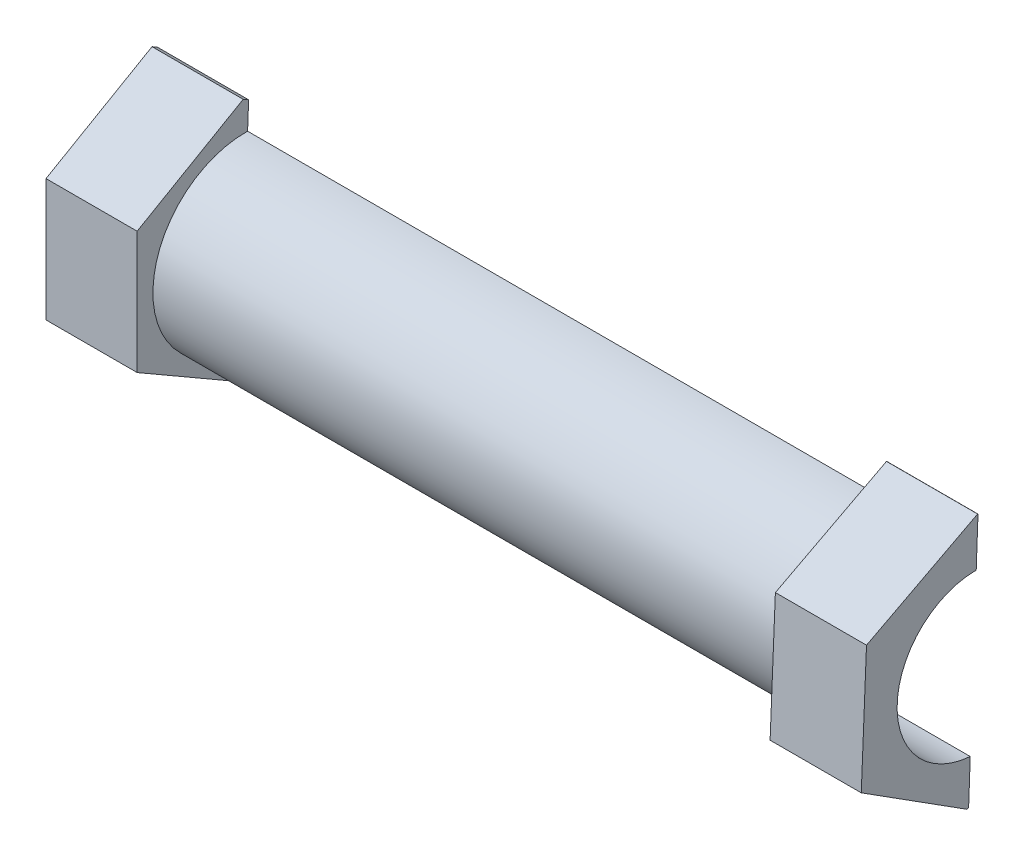
ISO-10303-21;
HEADER;
FILE_DESCRIPTION(('STEP AP214'),'2;1');
FILE_NAME('part.step','',(''),(''),'','','');
FILE_SCHEMA(('AUTOMOTIVE_DESIGN { 1 0 10303 214 1 1 1 1 }'));
ENDSEC;
DATA;
#1=APPLICATION_CONTEXT('core data for automotive mechanical design processes');
#2=APPLICATION_PROTOCOL_DEFINITION('international standard','automotive_design',2000,#1);
#3=PRODUCT_CONTEXT('',#1,'mechanical');
#4=PRODUCT('Part','Part','',(#3));
#5=PRODUCT_RELATED_PRODUCT_CATEGORY('part','',(#4));
#6=PRODUCT_DEFINITION_FORMATION('','',#4);
#7=PRODUCT_DEFINITION_CONTEXT('part definition',#1,'design');
#8=PRODUCT_DEFINITION('design','',#6,#7);
#9=PRODUCT_DEFINITION_SHAPE('','',#8);
#10=(LENGTH_UNIT() NAMED_UNIT(*) SI_UNIT(.MILLI.,.METRE.));
#11=(NAMED_UNIT(*) PLANE_ANGLE_UNIT() SI_UNIT($,.RADIAN.));
#12=(NAMED_UNIT(*) SI_UNIT($,.STERADIAN.) SOLID_ANGLE_UNIT());
#13=UNCERTAINTY_MEASURE_WITH_UNIT(LENGTH_MEASURE(1.E-05),#10,'distance_accuracy_value','');
#14=(GEOMETRIC_REPRESENTATION_CONTEXT(3) GLOBAL_UNCERTAINTY_ASSIGNED_CONTEXT((#13)) GLOBAL_UNIT_ASSIGNED_CONTEXT((#10,
#11,#12)) REPRESENTATION_CONTEXT('',''));
#15=CARTESIAN_POINT('',(0.,0.,0.));
#16=DIRECTION('',(0.,0.,1.));
#17=DIRECTION('',(1.,0.,0.));
#18=AXIS2_PLACEMENT_3D('',#15,#16,#17);
#19=CARTESIAN_POINT('',(350.,0.,-1.28970231793346));
#20=DIRECTION('',(-1.,0.,0.));
#21=DIRECTION('',(0.,0.,1.));
#22=AXIS2_PLACEMENT_3D('',#19,#20,#21);
#23=CYLINDRICAL_SURFACE('',#22,50.8003751134074);
#24=CARTESIAN_POINT('',(350.,0.,-1.28970231793346));
#25=DIRECTION('',(1.,0.,0.));
#26=DIRECTION('',(0.,0.,-1.));
#27=AXIS2_PLACEMENT_3D('',#24,#25,#26);
#28=CIRCLE('',#27,50.8003751134074);
#29=CARTESIAN_POINT('',(350.,50.7875610327071,-2.43064754534503));
#30=VERTEX_POINT('',#29);
#31=CARTESIAN_POINT('',(350.,-50.7298348775202,1.38648245940075));
#32=VERTEX_POINT('',#31);
#33=EDGE_CURVE('E224',#30,#32,#28,.T.);
#34=ORIENTED_EDGE('',*,*,#33,.F.);
#35=DIRECTION('',(-1.,0.,0.));
#36=VECTOR('',#35,1.);
#37=CARTESIAN_POINT('',(350.,50.7875610327071,-2.43064754534503));
#38=LINE('',#37,#36);
#39=CARTESIAN_POINT('',(0.,50.7875610327071,-2.43064754534503));
#40=VERTEX_POINT('',#39);
#41=EDGE_CURVE('E317',#30,#40,#38,.T.);
#42=ORIENTED_EDGE('',*,*,#41,.T.);
#43=CARTESIAN_POINT('',(0.,0.,-1.28970231793346));
#44=DIRECTION('',(1.,0.,0.));
#45=DIRECTION('',(0.,0.,-1.));
#46=AXIS2_PLACEMENT_3D('',#43,#44,#45);
#47=CIRCLE('',#46,50.8003751134074);
#48=CARTESIAN_POINT('',(0.,-50.7298348775202,1.38648245940076));
#49=VERTEX_POINT('',#48);
#50=EDGE_CURVE('E202',#40,#49,#47,.T.);
#51=ORIENTED_EDGE('',*,*,#50,.T.);
#52=DIRECTION('',(-1.,0.,0.));
#53=VECTOR('',#52,1.);
#54=CARTESIAN_POINT('',(350.,-50.7298348775202,1.38648245940075));
#55=LINE('',#54,#53);
#56=EDGE_CURVE('E309',#49,#32,#55,.F.);
#57=ORIENTED_EDGE('',*,*,#56,.T.);
#58=EDGE_LOOP('',(#34,#42,#51,#57));
#59=FACE_BOUND('',#58,.T.);
#60=ADVANCED_FACE('F33',(#59),#23,.T.);
#61=CARTESIAN_POINT('',(350.,0.,-1.28970231793346));
#62=DIRECTION('',(-1.,0.,0.));
#63=DIRECTION('',(0.,0.,1.));
#64=AXIS2_PLACEMENT_3D('',#61,#62,#63);
#65=CYLINDRICAL_SURFACE('',#64,47.812951640793);
#66=DIRECTION('',(-1.,0.,0.));
#67=VECTOR('',#66,1.);
#68=CARTESIAN_POINT('',(350.,47.8018844697725,-2.31838387377763));
#69=LINE('',#68,#67);
#70=CARTESIAN_POINT('',(350.,47.8018844697725,-2.31838387377763));
#71=VERTEX_POINT('',#70);
#72=CARTESIAN_POINT('',(0.,47.8018844697725,-2.31838387377763));
#73=VERTEX_POINT('',#72);
#74=EDGE_CURVE('E325',#71,#73,#69,.T.);
#75=ORIENTED_EDGE('',*,*,#74,.F.);
#76=CARTESIAN_POINT('',(350.,0.,-1.28970231793346));
#77=DIRECTION('',(1.,0.,0.));
#78=DIRECTION('',(0.,0.,-1.));
#79=AXIS2_PLACEMENT_3D('',#76,#77,#78);
#80=CIRCLE('',#79,47.812951640793);
#81=CARTESIAN_POINT('',(350.,-47.7441583145856,1.27421878783335));
#82=VERTEX_POINT('',#81);
#83=EDGE_CURVE('E218',#71,#82,#80,.T.);
#84=ORIENTED_EDGE('',*,*,#83,.T.);
#85=DIRECTION('',(-1.,0.,0.));
#86=VECTOR('',#85,1.);
#87=CARTESIAN_POINT('',(350.,-47.7441583145856,1.27421878783335));
#88=LINE('',#87,#86);
#89=CARTESIAN_POINT('',(0.,-47.7441583145856,1.27421878783335));
#90=VERTEX_POINT('',#89);
#91=EDGE_CURVE('E333',#90,#82,#88,.F.);
#92=ORIENTED_EDGE('',*,*,#91,.F.);
#93=CARTESIAN_POINT('',(0.,0.,-1.28970231793346));
#94=DIRECTION('',(1.,0.,0.));
#95=DIRECTION('',(0.,0.,-1.));
#96=AXIS2_PLACEMENT_3D('',#93,#94,#95);
#97=CIRCLE('',#96,47.812951640793);
#98=EDGE_CURVE('E221',#73,#90,#97,.T.);
#99=ORIENTED_EDGE('',*,*,#98,.F.);
#100=EDGE_LOOP('',(#75,#84,#92,#99));
#101=FACE_BOUND('',#100,.T.);
#102=ADVANCED_FACE('F365',(#101),#65,.F.);
#103=CARTESIAN_POINT('',(350.,0.,0.));
#104=DIRECTION('',(1.,0.,0.));
#105=DIRECTION('',(0.,0.,-1.));
#106=AXIS2_PLACEMENT_3D('',#103,#104,#105);
#107=PLANE('',#106);
#108=ORIENTED_EDGE('',*,*,#83,.F.);
#109=DIRECTION('',(0.,-0.999293840577614,0.0375741957151817));
#110=VECTOR('',#109,1.);
#111=CARTESIAN_POINT('',(350.,-0.0195622295631001,-0.52026171520879));
#112=LINE('',#111,#110);
#113=CARTESIAN_POINT('',(350.,42.4233203487883,-2.11614584053638));
#114=VERTEX_POINT('',#113);
#115=EDGE_CURVE('E238',#71,#114,#112,.T.);
#116=ORIENTED_EDGE('',*,*,#115,.T.);
#117=CARTESIAN_POINT('',(350.,-1.09442531969695,-2.23147845243465));
#118=DIRECTION('',(-1.,0.,0.));
#119=DIRECTION('',(0.,0.,1.));
#120=AXIS2_PLACEMENT_3D('',#117,#118,#119);
#121=CIRCLE('',#120,43.5178984979552);
#122=CARTESIAN_POINT('',(350.,-44.480631584882,1.15150774220864));
#123=VERTEX_POINT('',#122);
#124=EDGE_CURVE('E233',#123,#114,#121,.T.);
#125=ORIENTED_EDGE('',*,*,#124,.F.);
#126=EDGE_CURVE('E47',#123,#82,#112,.T.);
#127=ORIENTED_EDGE('',*,*,#126,.T.);
#128=EDGE_LOOP('',(#108,#116,#125,#127));
#129=FACE_BOUND('',#128,.T.);
#130=ADVANCED_FACE('F237',(#129),#107,.F.);
#131=CARTESIAN_POINT('',(400.,0.,0.));
#132=DIRECTION('',(1.,0.,0.));
#133=DIRECTION('',(0.,0.,-1.));
#134=AXIS2_PLACEMENT_3D('',#131,#132,#133);
#135=PLANE('',#134);
#136=DIRECTION('',(0.,-0.999293840577614,0.0375741957151817));
#137=VECTOR('',#136,1.);
#138=CARTESIAN_POINT('',(400.,77.5085150996979,-3.43537540119687));
#139=LINE('',#138,#137);
#140=CARTESIAN_POINT('',(400.,68.5723753093756,-3.09936986229981));
#141=VERTEX_POINT('',#140);
#142=CARTESIAN_POINT('',(400.,42.4233203487883,-2.11614584053638));
#143=VERTEX_POINT('',#142);
#144=EDGE_CURVE('E55',#141,#143,#139,.T.);
#145=ORIENTED_EDGE('',*,*,#144,.F.);
#146=DIRECTION('',(0.,0.535953103456129,0.844247754451111));
#147=VECTOR('',#146,1.);
#148=CARTESIAN_POINT('',(400.,31.8499448364857,-60.9455307760078));
#149=LINE('',#148,#147);
#150=CARTESIAN_POINT('',(400.,68.7053503173919,-2.88990405047429));
#151=VERTEX_POINT('',#150);
#152=EDGE_CURVE('E172',#141,#151,#149,.T.);
#153=ORIENTED_EDGE('',*,*,#152,.T.);
#154=DIRECTION('',(0.,-0.463163450714565,0.886272880055673));
#155=VECTOR('',#154,1.);
#156=CARTESIAN_POINT('',(400.,68.7053503173919,-2.88990405047429));
#157=LINE('',#156,#155);
#158=CARTESIAN_POINT('',(400.,36.8554054809062,58.0556267255335));
#159=VERTEX_POINT('',#158);
#160=EDGE_CURVE('E184',#151,#159,#157,.T.);
#161=ORIENTED_EDGE('',*,*,#160,.T.);
#162=DIRECTION('',(0.,-0.999116554170694,0.0420251256045615));
#163=VECTOR('',#162,1.);
#164=CARTESIAN_POINT('',(400.,36.8554054809062,58.0556267255335));
#165=LINE('',#164,#163);
#166=CARTESIAN_POINT('',(400.,-31.8499448364857,60.9455307760078));
#167=VERTEX_POINT('',#166);
#168=EDGE_CURVE('E187',#159,#167,#165,.T.);
#169=ORIENTED_EDGE('',*,*,#168,.T.);
#170=DIRECTION('',(0.,-0.535953103456129,-0.844247754451111));
#171=VECTOR('',#170,1.);
#172=CARTESIAN_POINT('',(400.,-31.8499448364857,60.9455307760078));
#173=LINE('',#172,#171);
#174=CARTESIAN_POINT('',(400.,-68.7053503173919,2.88990405047424));
#175=VERTEX_POINT('',#174);
#176=EDGE_CURVE('E195',#167,#175,#173,.T.);
#177=ORIENTED_EDGE('',*,*,#176,.T.);
#178=DIRECTION('',(0.,0.463163450714565,-0.886272880055673));
#179=VECTOR('',#178,1.);
#180=CARTESIAN_POINT('',(400.,-68.7053503173919,2.88990405047424));
#181=LINE('',#180,#179);
#182=CARTESIAN_POINT('',(400.,-68.2642180939224,2.04578838120778));
#183=VERTEX_POINT('',#182);
#184=EDGE_CURVE('E185',#175,#183,#181,.T.);
#185=ORIENTED_EDGE('',*,*,#184,.T.);
#186=CARTESIAN_POINT('',(400.,-44.480631584882,1.15150774220864));
#187=VERTEX_POINT('',#186);
#188=EDGE_CURVE('E178',#187,#183,#139,.T.);
#189=ORIENTED_EDGE('',*,*,#188,.F.);
#190=CARTESIAN_POINT('',(400.,-1.09442531969695,-2.23147845243465));
#191=DIRECTION('',(-1.,0.,0.));
#192=DIRECTION('',(0.,0.,1.));
#193=AXIS2_PLACEMENT_3D('',#190,#191,#192);
#194=CIRCLE('',#193,43.5178984979552);
#195=EDGE_CURVE('E176',#187,#143,#194,.T.);
#196=ORIENTED_EDGE('',*,*,#195,.T.);
#197=EDGE_LOOP('',(#145,#153,#161,#169,#177,#185,#189,#196));
#198=FACE_BOUND('',#197,.T.);
#199=ADVANCED_FACE('F171',(#198),#135,.T.);
#200=DIRECTION('',(0.,0.535953103456129,0.844247754451111));
#201=VECTOR('',#200,1.);
#202=CARTESIAN_POINT('',(350.,31.8499448364857,-60.9455307760078));
#203=LINE('',#202,#201);
#204=CARTESIAN_POINT('',(350.,68.5723753093756,-3.09936986229981));
#205=VERTEX_POINT('',#204);
#206=CARTESIAN_POINT('',(350.,68.7053503173919,-2.88990405047429));
#207=VERTEX_POINT('',#206);
#208=EDGE_CURVE('E201',#205,#207,#203,.T.);
#209=ORIENTED_EDGE('',*,*,#208,.F.);
#210=DIRECTION('',(0.,-0.999293840577614,0.0375741957151817));
#211=VECTOR('',#210,1.);
#212=CARTESIAN_POINT('',(350.,-0.0195622295631001,-0.52026171520879));
#213=LINE('',#212,#211);
#214=EDGE_CURVE('E163',#205,#30,#213,.T.);
#215=ORIENTED_EDGE('',*,*,#214,.T.);
#216=ORIENTED_EDGE('',*,*,#33,.T.);
#217=CARTESIAN_POINT('',(350.,-68.2642180939224,2.04578838120777));
#218=VERTEX_POINT('',#217);
#219=EDGE_CURVE('E244',#32,#218,#213,.T.);
#220=ORIENTED_EDGE('',*,*,#219,.T.);
#221=DIRECTION('',(0.,0.463163450714565,-0.886272880055673));
#222=VECTOR('',#221,1.);
#223=CARTESIAN_POINT('',(350.,-68.7053503173919,2.88990405047424));
#224=LINE('',#223,#222);
#225=CARTESIAN_POINT('',(350.,-68.7053503173919,2.88990405047424));
#226=VERTEX_POINT('',#225);
#227=EDGE_CURVE('E198',#226,#218,#224,.T.);
#228=ORIENTED_EDGE('',*,*,#227,.F.);
#229=DIRECTION('',(0.,-0.535953103456129,-0.844247754451111));
#230=VECTOR('',#229,1.);
#231=CARTESIAN_POINT('',(350.,-31.8499448364857,60.9455307760078));
#232=LINE('',#231,#230);
#233=CARTESIAN_POINT('',(350.,-31.8499448364857,60.9455307760078));
#234=VERTEX_POINT('',#233);
#235=EDGE_CURVE('E190',#234,#226,#232,.T.);
#236=ORIENTED_EDGE('',*,*,#235,.F.);
#237=DIRECTION('',(0.,-0.999116554170694,0.0420251256045615));
#238=VECTOR('',#237,1.);
#239=CARTESIAN_POINT('',(350.,36.8554054809062,58.0556267255335));
#240=LINE('',#239,#238);
#241=CARTESIAN_POINT('',(350.,36.8554054809062,58.0556267255335));
#242=VERTEX_POINT('',#241);
#243=EDGE_CURVE('E206',#242,#234,#240,.T.);
#244=ORIENTED_EDGE('',*,*,#243,.F.);
#245=DIRECTION('',(0.,-0.463163450714565,0.886272880055673));
#246=VECTOR('',#245,1.);
#247=CARTESIAN_POINT('',(350.,68.7053503173919,-2.88990405047429));
#248=LINE('',#247,#246);
#249=EDGE_CURVE('E204',#207,#242,#248,.T.);
#250=ORIENTED_EDGE('',*,*,#249,.F.);
#251=EDGE_LOOP('',(#209,#215,#216,#220,#228,#236,#244,#250));
#252=FACE_BOUND('',#251,.T.);
#253=ADVANCED_FACE('F350',(#252),#107,.F.);
#254=CARTESIAN_POINT('',(400.,-68.7053503173919,2.88990405047424));
#255=DIRECTION('',(0.,0.886272880055673,0.463163450714565));
#256=DIRECTION('',(0.,-0.463163450714565,0.886272880055673));
#257=AXIS2_PLACEMENT_3D('',#254,#255,#256);
#258=PLANE('',#257);
#259=ORIENTED_EDGE('',*,*,#227,.T.);
#260=DIRECTION('',(1.,0.,0.));
#261=VECTOR('',#260,1.);
#262=CARTESIAN_POINT('',(400.,-68.2642180939224,2.04578838120777));
#263=LINE('',#262,#261);
#264=EDGE_CURVE('E239',#218,#183,#263,.T.);
#265=ORIENTED_EDGE('',*,*,#264,.T.);
#266=ORIENTED_EDGE('',*,*,#184,.F.);
#267=DIRECTION('',(-1.,0.,0.));
#268=VECTOR('',#267,1.);
#269=CARTESIAN_POINT('',(400.,-68.7053503173919,2.88990405047424));
#270=LINE('',#269,#268);
#271=EDGE_CURVE('E197',#175,#226,#270,.T.);
#272=ORIENTED_EDGE('',*,*,#271,.T.);
#273=EDGE_LOOP('',(#259,#265,#266,#272));
#274=FACE_BOUND('',#273,.T.);
#275=ADVANCED_FACE('F340',(#274),#258,.F.);
#276=CARTESIAN_POINT('',(400.,31.8499448364857,-60.9455307760078));
#277=DIRECTION('',(0.,-0.844247754451111,0.535953103456129));
#278=DIRECTION('',(0.,-0.535953103456129,-0.844247754451111));
#279=AXIS2_PLACEMENT_3D('',#276,#277,#278);
#280=PLANE('',#279);
#281=ORIENTED_EDGE('',*,*,#152,.F.);
#282=DIRECTION('',(-1.,0.,0.));
#283=VECTOR('',#282,1.);
#284=CARTESIAN_POINT('',(400.,68.5723753093756,-3.09936986229981));
#285=LINE('',#284,#283);
#286=EDGE_CURVE('E160',#141,#205,#285,.T.);
#287=ORIENTED_EDGE('',*,*,#286,.T.);
#288=ORIENTED_EDGE('',*,*,#208,.T.);
#289=DIRECTION('',(-1.,0.,0.));
#290=VECTOR('',#289,1.);
#291=CARTESIAN_POINT('',(400.,68.7053503173919,-2.88990405047429));
#292=LINE('',#291,#290);
#293=EDGE_CURVE('E182',#151,#207,#292,.T.);
#294=ORIENTED_EDGE('',*,*,#293,.F.);
#295=EDGE_LOOP('',(#281,#287,#288,#294));
#296=FACE_BOUND('',#295,.T.);
#297=ADVANCED_FACE('F180',(#296),#280,.F.);
#298=CARTESIAN_POINT('',(400.,68.7053503173919,-2.88990405047429));
#299=DIRECTION('',(0.,-0.886272880055673,-0.463163450714565));
#300=DIRECTION('',(0.,0.463163450714565,-0.886272880055673));
#301=AXIS2_PLACEMENT_3D('',#298,#299,#300);
#302=PLANE('',#301);
#303=ORIENTED_EDGE('',*,*,#249,.T.);
#304=DIRECTION('',(-1.,0.,0.));
#305=VECTOR('',#304,1.);
#306=CARTESIAN_POINT('',(400.,36.8554054809062,58.0556267255335));
#307=LINE('',#306,#305);
#308=EDGE_CURVE('E214',#159,#242,#307,.T.);
#309=ORIENTED_EDGE('',*,*,#308,.F.);
#310=ORIENTED_EDGE('',*,*,#160,.F.);
#311=ORIENTED_EDGE('',*,*,#293,.T.);
#312=EDGE_LOOP('',(#303,#309,#310,#311));
#313=FACE_BOUND('',#312,.T.);
#314=ADVANCED_FACE('F377',(#313),#302,.F.);
#315=CARTESIAN_POINT('',(400.,36.8554054809062,58.0556267255335));
#316=DIRECTION('',(0.,-0.0420251256045615,-0.999116554170694));
#317=DIRECTION('',(0.,0.999116554170694,-0.0420251256045615));
#318=AXIS2_PLACEMENT_3D('',#315,#316,#317);
#319=PLANE('',#318);
#320=ORIENTED_EDGE('',*,*,#243,.T.);
#321=DIRECTION('',(-1.,0.,0.));
#322=VECTOR('',#321,1.);
#323=CARTESIAN_POINT('',(400.,-31.8499448364857,60.9455307760078));
#324=LINE('',#323,#322);
#325=EDGE_CURVE('E211',#167,#234,#324,.T.);
#326=ORIENTED_EDGE('',*,*,#325,.F.);
#327=ORIENTED_EDGE('',*,*,#168,.F.);
#328=ORIENTED_EDGE('',*,*,#308,.T.);
#329=EDGE_LOOP('',(#320,#326,#327,#328));
#330=FACE_BOUND('',#329,.T.);
#331=ADVANCED_FACE('F380',(#330),#319,.F.);
#332=CARTESIAN_POINT('',(400.,-31.8499448364857,60.9455307760078));
#333=DIRECTION('',(0.,0.844247754451111,-0.535953103456129));
#334=DIRECTION('',(0.,0.535953103456129,0.844247754451111));
#335=AXIS2_PLACEMENT_3D('',#332,#333,#334);
#336=PLANE('',#335);
#337=ORIENTED_EDGE('',*,*,#235,.T.);
#338=ORIENTED_EDGE('',*,*,#271,.F.);
#339=ORIENTED_EDGE('',*,*,#176,.F.);
#340=ORIENTED_EDGE('',*,*,#325,.T.);
#341=EDGE_LOOP('',(#337,#338,#339,#340));
#342=FACE_BOUND('',#341,.T.);
#343=ADVANCED_FACE('F347',(#342),#336,.F.);
#344=CARTESIAN_POINT('',(0.,0.,0.));
#345=DIRECTION('',(-1.,0.,0.));
#346=DIRECTION('',(0.,0.,1.));
#347=AXIS2_PLACEMENT_3D('',#344,#345,#346);
#348=PLANE('',#347);
#349=ORIENTED_EDGE('',*,*,#98,.T.);
#350=DIRECTION('',(0.,0.999293840577614,-0.0375741957151817));
#351=VECTOR('',#350,1.);
#352=CARTESIAN_POINT('',(0.,-0.0195622295631001,-0.52026171520879));
#353=LINE('',#352,#351);
#354=CARTESIAN_POINT('',(0.,-44.8726669224978,1.16624856408175));
#355=VERTEX_POINT('',#354);
#356=EDGE_CURVE('E330',#90,#355,#353,.T.);
#357=ORIENTED_EDGE('',*,*,#356,.T.);
#358=CARTESIAN_POINT('',(0.,0.,-2.16727803402694));
#359=DIRECTION('',(1.,0.,0.));
#360=DIRECTION('',(0.,0.,-1.));
#361=AXIS2_PLACEMENT_3D('',#358,#359,#360);
#362=CIRCLE('',#361,44.9963180306759);
#363=CARTESIAN_POINT('',(0.,44.996294911021,-2.21289160824334));
#364=VERTEX_POINT('',#363);
#365=EDGE_CURVE('E241',#364,#355,#362,.T.);
#366=ORIENTED_EDGE('',*,*,#365,.F.);
#367=EDGE_CURVE('E324',#364,#73,#353,.T.);
#368=ORIENTED_EDGE('',*,*,#367,.T.);
#369=EDGE_LOOP('',(#349,#357,#366,#368));
#370=FACE_BOUND('',#369,.T.);
#371=ADVANCED_FACE('F360',(#370),#348,.F.);
#372=CARTESIAN_POINT('',(-50.,-67.16135301654,0.));
#373=DIRECTION('',(0.,0.866025403784438,-0.500000000000001));
#374=DIRECTION('',(0.,0.500000000000001,0.866025403784438));
#375=AXIS2_PLACEMENT_3D('',#372,#373,#374);
#376=PLANE('',#375);
#377=DIRECTION('',(0.,0.500000000000001,0.866025403784438));
#378=VECTOR('',#377,1.);
#379=CARTESIAN_POINT('',(-50.,-67.16135301654,0.));
#380=LINE('',#379,#378);
#381=CARTESIAN_POINT('',(-50.,-66.0287459655017,1.96173295740914));
#382=VERTEX_POINT('',#381);
#383=CARTESIAN_POINT('',(-50.,-33.5806765082699,58.1634378648584));
#384=VERTEX_POINT('',#383);
#385=EDGE_CURVE('E253',#382,#384,#380,.T.);
#386=ORIENTED_EDGE('',*,*,#385,.F.);
#387=DIRECTION('',(1.,0.,0.));
#388=VECTOR('',#387,1.);
#389=CARTESIAN_POINT('',(-50.,-66.0287459655017,1.96173295740914));
#390=LINE('',#389,#388);
#391=CARTESIAN_POINT('',(0.,-66.0287459655017,1.96173295740913));
#392=VERTEX_POINT('',#391);
#393=EDGE_CURVE('E308',#382,#392,#390,.T.);
#394=ORIENTED_EDGE('',*,*,#393,.T.);
#395=DIRECTION('',(0.,0.500000000000001,0.866025403784438));
#396=VECTOR('',#395,1.);
#397=CARTESIAN_POINT('',(0.,-67.16135301654,0.));
#398=LINE('',#397,#396);
#399=CARTESIAN_POINT('',(0.,-33.5806765082699,58.1634378648584));
#400=VERTEX_POINT('',#399);
#401=EDGE_CURVE('E250',#392,#400,#398,.T.);
#402=ORIENTED_EDGE('',*,*,#401,.T.);
#403=DIRECTION('',(1.,0.,0.));
#404=VECTOR('',#403,1.);
#405=CARTESIAN_POINT('',(-50.,-33.5806765082699,58.1634378648584));
#406=LINE('',#405,#404);
#407=EDGE_CURVE('E228',#384,#400,#406,.T.);
#408=ORIENTED_EDGE('',*,*,#407,.F.);
#409=EDGE_LOOP('',(#386,#394,#402,#408));
#410=FACE_BOUND('',#409,.T.);
#411=ADVANCED_FACE('F307',(#410),#376,.F.);
#412=CARTESIAN_POINT('',(-50.,-33.5806765082699,58.1634378648584));
#413=DIRECTION('',(0.,0.,-1.));
#414=DIRECTION('',(0.,1.,0.));
#415=AXIS2_PLACEMENT_3D('',#412,#413,#414);
#416=PLANE('',#415);
#417=DIRECTION('',(0.,1.,0.));
#418=VECTOR('',#417,1.);
#419=CARTESIAN_POINT('',(0.,-33.5806765082699,58.1634378648584));
#420=LINE('',#419,#418);
#421=CARTESIAN_POINT('',(0.,33.5806765082703,58.1634378648581));
#422=VERTEX_POINT('',#421);
#423=EDGE_CURVE('E265',#400,#422,#420,.T.);
#424=ORIENTED_EDGE('',*,*,#423,.T.);
#425=DIRECTION('',(1.,0.,0.));
#426=VECTOR('',#425,1.);
#427=CARTESIAN_POINT('',(-50.,33.5806765082703,58.1634378648581));
#428=LINE('',#427,#426);
#429=CARTESIAN_POINT('',(-50.,33.5806765082703,58.1634378648581));
#430=VERTEX_POINT('',#429);
#431=EDGE_CURVE('E273',#430,#422,#428,.T.);
#432=ORIENTED_EDGE('',*,*,#431,.F.);
#433=DIRECTION('',(0.,1.,0.));
#434=VECTOR('',#433,1.);
#435=CARTESIAN_POINT('',(-50.,-33.5806765082699,58.1634378648584));
#436=LINE('',#435,#434);
#437=EDGE_CURVE('E255',#384,#430,#436,.T.);
#438=ORIENTED_EDGE('',*,*,#437,.F.);
#439=ORIENTED_EDGE('',*,*,#407,.T.);
#440=EDGE_LOOP('',(#424,#432,#438,#439));
#441=FACE_BOUND('',#440,.T.);
#442=ADVANCED_FACE('F280',(#441),#416,.F.);
#443=CARTESIAN_POINT('',(-50.,33.5806765082703,58.1634378648581));
#444=DIRECTION('',(0.,-0.866025403784442,-0.499999999999995));
#445=DIRECTION('',(0.,0.499999999999995,-0.866025403784442));
#446=AXIS2_PLACEMENT_3D('',#443,#444,#445);
#447=PLANE('',#446);
#448=DIRECTION('',(0.,0.499999999999995,-0.866025403784442));
#449=VECTOR('',#448,1.);
#450=CARTESIAN_POINT('',(0.,33.5806765082703,58.1634378648581));
#451=LINE('',#450,#449);
#452=CARTESIAN_POINT('',(0.,67.16135301654,-4.68985221497411E-13));
#453=VERTEX_POINT('',#452);
#454=EDGE_CURVE('E267',#422,#453,#451,.T.);
#455=ORIENTED_EDGE('',*,*,#454,.T.);
#456=DIRECTION('',(1.,0.,0.));
#457=VECTOR('',#456,1.);
#458=CARTESIAN_POINT('',(-50.,67.16135301654,-4.68985221497411E-13));
#459=LINE('',#458,#457);
#460=CARTESIAN_POINT('',(-50.,67.16135301654,-4.68985221497411E-13));
#461=VERTEX_POINT('',#460);
#462=EDGE_CURVE('E263',#461,#453,#459,.T.);
#463=ORIENTED_EDGE('',*,*,#462,.F.);
#464=DIRECTION('',(0.,0.499999999999995,-0.866025403784442));
#465=VECTOR('',#464,1.);
#466=CARTESIAN_POINT('',(-50.,33.5806765082703,58.1634378648581));
#467=LINE('',#466,#465);
#468=EDGE_CURVE('E258',#430,#461,#467,.T.);
#469=ORIENTED_EDGE('',*,*,#468,.F.);
#470=ORIENTED_EDGE('',*,*,#431,.T.);
#471=EDGE_LOOP('',(#455,#463,#469,#470));
#472=FACE_BOUND('',#471,.T.);
#473=ADVANCED_FACE('F293',(#472),#447,.F.);
#474=CARTESIAN_POINT('',(-50.,67.16135301654,-4.68985221497411E-13));
#475=DIRECTION('',(0.,-0.866025403784435,0.500000000000007));
#476=DIRECTION('',(0.,-0.500000000000007,-0.866025403784435));
#477=AXIS2_PLACEMENT_3D('',#474,#475,#476);
#478=PLANE('',#477);
#479=DIRECTION('',(0.,-0.500000000000007,-0.866025403784435));
#480=VECTOR('',#479,1.);
#481=CARTESIAN_POINT('',(0.,67.16135301654,-4.68985221497411E-13));
#482=LINE('',#481,#480);
#483=CARTESIAN_POINT('',(0.,65.439932571048,-2.98158767278037));
#484=VERTEX_POINT('',#483);
#485=EDGE_CURVE('E256',#453,#484,#482,.T.);
#486=ORIENTED_EDGE('',*,*,#485,.T.);
#487=DIRECTION('',(-1.,0.,0.));
#488=VECTOR('',#487,1.);
#489=CARTESIAN_POINT('',(-50.,65.439932571048,-2.98158767278037));
#490=LINE('',#489,#488);
#491=CARTESIAN_POINT('',(-50.,65.439932571048,-2.98158767278037));
#492=VERTEX_POINT('',#491);
#493=EDGE_CURVE('E299',#484,#492,#490,.T.);
#494=ORIENTED_EDGE('',*,*,#493,.T.);
#495=DIRECTION('',(0.,-0.500000000000007,-0.866025403784435));
#496=VECTOR('',#495,1.);
#497=CARTESIAN_POINT('',(-50.,67.16135301654,-4.68985221497411E-13));
#498=LINE('',#497,#496);
#499=EDGE_CURVE('E260',#461,#492,#498,.T.);
#500=ORIENTED_EDGE('',*,*,#499,.F.);
#501=ORIENTED_EDGE('',*,*,#462,.T.);
#502=EDGE_LOOP('',(#486,#494,#500,#501));
#503=FACE_BOUND('',#502,.T.);
#504=ADVANCED_FACE('F297',(#503),#478,.F.);
#505=CARTESIAN_POINT('',(-50.,0.,0.));
#506=DIRECTION('',(-1.,0.,0.));
#507=DIRECTION('',(0.,0.,1.));
#508=AXIS2_PLACEMENT_3D('',#505,#506,#507);
#509=PLANE('',#508);
#510=DIRECTION('',(0.,-0.999293840577614,0.0375741957151817));
#511=VECTOR('',#510,1.);
#512=CARTESIAN_POINT('',(-50.,77.5085150996979,-3.43537540119687));
#513=LINE('',#512,#511);
#514=CARTESIAN_POINT('',(-50.0000000000001,-44.8726669224978,1.16624856408174));
#515=VERTEX_POINT('',#514);
#516=EDGE_CURVE('E177',#515,#382,#513,.T.);
#517=ORIENTED_EDGE('',*,*,#516,.T.);
#518=ORIENTED_EDGE('',*,*,#385,.T.);
#519=ORIENTED_EDGE('',*,*,#437,.T.);
#520=ORIENTED_EDGE('',*,*,#468,.T.);
#521=ORIENTED_EDGE('',*,*,#499,.T.);
#522=CARTESIAN_POINT('',(-50.0000000000001,44.996294911021,-2.21289160824334));
#523=VERTEX_POINT('',#522);
#524=EDGE_CURVE('E304',#492,#523,#513,.T.);
#525=ORIENTED_EDGE('',*,*,#524,.T.);
#526=CARTESIAN_POINT('',(-50.,0.,-2.16727803402694));
#527=DIRECTION('',(1.,0.,0.));
#528=DIRECTION('',(0.,0.,-1.));
#529=AXIS2_PLACEMENT_3D('',#526,#527,#528);
#530=CIRCLE('',#529,44.9963180306759);
#531=EDGE_CURVE('E247',#523,#515,#530,.T.);
#532=ORIENTED_EDGE('',*,*,#531,.T.);
#533=EDGE_LOOP('',(#517,#518,#519,#520,#521,#525,#532));
#534=FACE_BOUND('',#533,.T.);
#535=ADVANCED_FACE('F303',(#534),#509,.T.);
#536=ORIENTED_EDGE('',*,*,#401,.F.);
#537=DIRECTION('',(0.,0.999293840577614,-0.0375741957151817));
#538=VECTOR('',#537,1.);
#539=CARTESIAN_POINT('',(0.,-0.0195622295631001,-0.52026171520879));
#540=LINE('',#539,#538);
#541=EDGE_CURVE('E167',#392,#49,#540,.T.);
#542=ORIENTED_EDGE('',*,*,#541,.T.);
#543=ORIENTED_EDGE('',*,*,#50,.F.);
#544=EDGE_CURVE('E314',#40,#484,#540,.T.);
#545=ORIENTED_EDGE('',*,*,#544,.T.);
#546=ORIENTED_EDGE('',*,*,#485,.F.);
#547=ORIENTED_EDGE('',*,*,#454,.F.);
#548=ORIENTED_EDGE('',*,*,#423,.F.);
#549=EDGE_LOOP('',(#536,#542,#543,#545,#546,#547,#548));
#550=FACE_BOUND('',#549,.T.);
#551=ADVANCED_FACE('F287',(#550),#348,.F.);
#552=CARTESIAN_POINT('',(-50.,0.,-2.16727803402694));
#553=DIRECTION('',(1.,0.,0.));
#554=DIRECTION('',(0.,0.,-1.));
#555=AXIS2_PLACEMENT_3D('',#552,#553,#554);
#556=CYLINDRICAL_SURFACE('',#555,44.9963180306759);
#557=ORIENTED_EDGE('',*,*,#365,.T.);
#558=DIRECTION('',(1.,0.,0.));
#559=VECTOR('',#558,1.);
#560=CARTESIAN_POINT('',(-50.,-44.8726669224978,1.16624856408174));
#561=LINE('',#560,#559);
#562=EDGE_CURVE('E327',#355,#515,#561,.F.);
#563=ORIENTED_EDGE('',*,*,#562,.T.);
#564=ORIENTED_EDGE('',*,*,#531,.F.);
#565=DIRECTION('',(1.,0.,0.));
#566=VECTOR('',#565,1.);
#567=CARTESIAN_POINT('',(-50.,44.996294911021,-2.21289160824334));
#568=LINE('',#567,#566);
#569=EDGE_CURVE('E321',#523,#364,#568,.T.);
#570=ORIENTED_EDGE('',*,*,#569,.T.);
#571=EDGE_LOOP('',(#557,#563,#564,#570));
#572=FACE_BOUND('',#571,.T.);
#573=ADVANCED_FACE('F358',(#572),#556,.F.);
#574=CARTESIAN_POINT('',(400.,-1.09442531969695,-2.23147845243465));
#575=DIRECTION('',(-1.,0.,0.));
#576=DIRECTION('',(0.,0.,1.));
#577=AXIS2_PLACEMENT_3D('',#574,#575,#576);
#578=CYLINDRICAL_SURFACE('',#577,43.5178984979552);
#579=ORIENTED_EDGE('',*,*,#124,.T.);
#580=DIRECTION('',(-1.,0.,0.));
#581=VECTOR('',#580,1.);
#582=CARTESIAN_POINT('',(400.,42.4233203487883,-2.11614584053638));
#583=LINE('',#582,#581);
#584=EDGE_CURVE('E11',#114,#143,#583,.F.);
#585=ORIENTED_EDGE('',*,*,#584,.T.);
#586=ORIENTED_EDGE('',*,*,#195,.F.);
#587=DIRECTION('',(-1.,0.,0.));
#588=VECTOR('',#587,1.);
#589=CARTESIAN_POINT('',(400.,-44.480631584882,1.15150774220864));
#590=LINE('',#589,#588);
#591=EDGE_CURVE('E40',#187,#123,#590,.T.);
#592=ORIENTED_EDGE('',*,*,#591,.T.);
#593=EDGE_LOOP('',(#579,#585,#586,#592));
#594=FACE_BOUND('',#593,.T.);
#595=ADVANCED_FACE('F232',(#594),#578,.F.);
#596=CARTESIAN_POINT('',(-50.,77.5085150996979,-3.43537540119687));
#597=DIRECTION('',(0.,0.0375741957151817,0.999293840577614));
#598=DIRECTION('',(0.,-0.999293840577614,0.0375741957151817));
#599=AXIS2_PLACEMENT_3D('',#596,#597,#598);
#600=PLANE('',#599);
#601=ORIENTED_EDGE('',*,*,#219,.F.);
#602=ORIENTED_EDGE('',*,*,#56,.F.);
#603=ORIENTED_EDGE('',*,*,#541,.F.);
#604=ORIENTED_EDGE('',*,*,#393,.F.);
#605=ORIENTED_EDGE('',*,*,#516,.F.);
#606=ORIENTED_EDGE('',*,*,#562,.F.);
#607=ORIENTED_EDGE('',*,*,#356,.F.);
#608=ORIENTED_EDGE('',*,*,#91,.T.);
#609=ORIENTED_EDGE('',*,*,#126,.F.);
#610=ORIENTED_EDGE('',*,*,#591,.F.);
#611=ORIENTED_EDGE('',*,*,#188,.T.);
#612=ORIENTED_EDGE('',*,*,#264,.F.);
#613=EDGE_LOOP('',(#601,#602,#603,#604,#605,#606,#607,#608,#609,#610,#611,#612));
#614=FACE_BOUND('',#613,.T.);
#615=ADVANCED_FACE('F336',(#614),#600,.F.);
#616=ORIENTED_EDGE('',*,*,#144,.T.);
#617=ORIENTED_EDGE('',*,*,#584,.F.);
#618=ORIENTED_EDGE('',*,*,#115,.F.);
#619=ORIENTED_EDGE('',*,*,#74,.T.);
#620=ORIENTED_EDGE('',*,*,#367,.F.);
#621=ORIENTED_EDGE('',*,*,#569,.F.);
#622=ORIENTED_EDGE('',*,*,#524,.F.);
#623=ORIENTED_EDGE('',*,*,#493,.F.);
#624=ORIENTED_EDGE('',*,*,#544,.F.);
#625=ORIENTED_EDGE('',*,*,#41,.F.);
#626=ORIENTED_EDGE('',*,*,#214,.F.);
#627=ORIENTED_EDGE('',*,*,#286,.F.);
#628=EDGE_LOOP('',(#616,#617,#618,#619,#620,#621,#622,#623,#624,#625,#626,#627));
#629=FACE_BOUND('',#628,.T.);
#630=ADVANCED_FACE('F161',(#629),#600,.F.);
#631=CLOSED_SHELL('',(#60,#102,#130,#199,#253,#275,#297,#314,#331,#343,#371,#411,#442,#473,#504,
#535,#551,#573,#595,#615,#630));
#632=MANIFOLD_SOLID_BREP('B2',#631);
#633=ADVANCED_BREP_SHAPE_REPRESENTATION('',(#18,#632),#14);
#634=SHAPE_DEFINITION_REPRESENTATION(#9,#633);
ENDSEC;
END-ISO-10303-21;
